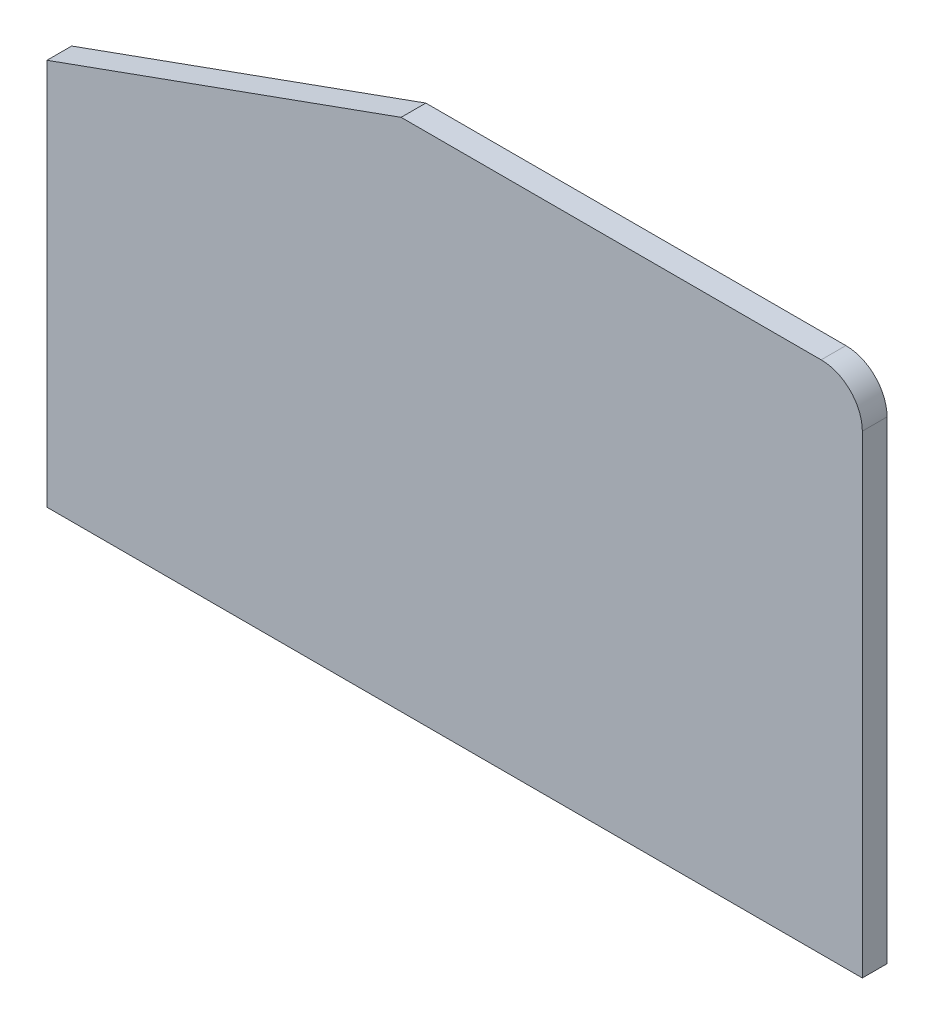
ISO-10303-21;
HEADER;
FILE_DESCRIPTION(('STEP AP214'),'2;1');
FILE_NAME('part.step','',(''),(''),'','','');
FILE_SCHEMA(('AUTOMOTIVE_DESIGN { 1 0 10303 214 1 1 1 1 }'));
ENDSEC;
DATA;
#1=APPLICATION_CONTEXT('core data for automotive mechanical design processes');
#2=APPLICATION_PROTOCOL_DEFINITION('international standard','automotive_design',2000,#1);
#3=PRODUCT_CONTEXT('',#1,'mechanical');
#4=PRODUCT('Part','Part','',(#3));
#5=PRODUCT_RELATED_PRODUCT_CATEGORY('part','',(#4));
#6=PRODUCT_DEFINITION_FORMATION('','',#4);
#7=PRODUCT_DEFINITION_CONTEXT('part definition',#1,'design');
#8=PRODUCT_DEFINITION('design','',#6,#7);
#9=PRODUCT_DEFINITION_SHAPE('','',#8);
#10=(LENGTH_UNIT() NAMED_UNIT(*) SI_UNIT(.MILLI.,.METRE.));
#11=(NAMED_UNIT(*) PLANE_ANGLE_UNIT() SI_UNIT($,.RADIAN.));
#12=(NAMED_UNIT(*) SI_UNIT($,.STERADIAN.) SOLID_ANGLE_UNIT());
#13=UNCERTAINTY_MEASURE_WITH_UNIT(LENGTH_MEASURE(1.E-05),#10,'distance_accuracy_value','');
#14=(GEOMETRIC_REPRESENTATION_CONTEXT(3) GLOBAL_UNCERTAINTY_ASSIGNED_CONTEXT((#13)) GLOBAL_UNIT_ASSIGNED_CONTEXT((#10,
#11,#12)) REPRESENTATION_CONTEXT('',''));
#15=CARTESIAN_POINT('',(0.,0.,0.));
#16=DIRECTION('',(0.,0.,1.));
#17=DIRECTION('',(1.,0.,0.));
#18=AXIS2_PLACEMENT_3D('',#15,#16,#17);
#19=CARTESIAN_POINT('',(99.0000000000002,-62.5,3.00000000000045));
#20=DIRECTION('',(-1.00000000000001,0.,0.));
#21=DIRECTION('',(0.,0.,1.00000000000001));
#22=AXIS2_PLACEMENT_3D('',#19,#20,#21);
#23=PLANE('',#22);
#24=DIRECTION('',(0.,1.,0.));
#25=VECTOR('',#24,1.);
#26=CARTESIAN_POINT('',(99.0000000000004,-62.5,-3.00000000000045));
#27=LINE('',#26,#25);
#28=CARTESIAN_POINT('',(99.0000000000004,-62.5,-3.00000000000045));
#29=VERTEX_POINT('',#28);
#30=CARTESIAN_POINT('',(99.0000000000004,52.5,-3.00000000000045));
#31=VERTEX_POINT('',#30);
#32=EDGE_CURVE('E135',#29,#31,#27,.T.);
#33=ORIENTED_EDGE('',*,*,#32,.T.);
#34=DIRECTION('',(0.,0.,-1.00000000000001));
#35=VECTOR('',#34,1.);
#36=CARTESIAN_POINT('',(99.0000000000002,52.5,3.00000000000045));
#37=LINE('',#36,#35);
#38=CARTESIAN_POINT('',(99.0000000000002,52.5,3.00000000000045));
#39=VERTEX_POINT('',#38);
#40=EDGE_CURVE('E59',#31,#39,#37,.F.);
#41=ORIENTED_EDGE('',*,*,#40,.T.);
#42=DIRECTION('',(0.,1.,0.));
#43=VECTOR('',#42,1.);
#44=CARTESIAN_POINT('',(99.0000000000002,-62.5,3.00000000000045));
#45=LINE('',#44,#43);
#46=CARTESIAN_POINT('',(99.0000000000002,-62.5,3.00000000000045));
#47=VERTEX_POINT('',#46);
#48=EDGE_CURVE('E113',#47,#39,#45,.T.);
#49=ORIENTED_EDGE('',*,*,#48,.F.);
#50=DIRECTION('',(0.,0.,-1.00000000000001));
#51=VECTOR('',#50,1.);
#52=CARTESIAN_POINT('',(99.0000000000002,-62.5,3.00000000000045));
#53=LINE('',#52,#51);
#54=EDGE_CURVE('E134',#47,#29,#53,.T.);
#55=ORIENTED_EDGE('',*,*,#54,.T.);
#56=EDGE_LOOP('',(#33,#41,#49,#55));
#57=FACE_BOUND('',#56,.T.);
#58=ADVANCED_FACE('F51',(#57),#23,.F.);
#59=CARTESIAN_POINT('',(-12.9999999999999,62.5,3.00000000000017));
#60=DIRECTION('',(0.,-1.,0.));
#61=DIRECTION('',(0.,0.,-1.00000000000001));
#62=AXIS2_PLACEMENT_3D('',#59,#60,#61);
#63=PLANE('',#62);
#64=DIRECTION('',(-1.00000000000001,0.,0.));
#65=VECTOR('',#64,1.);
#66=CARTESIAN_POINT('',(-12.9999999999999,62.5,3.00000000000017));
#67=LINE('',#66,#65);
#68=CARTESIAN_POINT('',(89.0000000000002,62.5,3.00000000000028));
#69=VERTEX_POINT('',#68);
#70=CARTESIAN_POINT('',(-12.9999999999999,62.5,3.00000000000017));
#71=VERTEX_POINT('',#70);
#72=EDGE_CURVE('E103',#69,#71,#67,.T.);
#73=ORIENTED_EDGE('',*,*,#72,.F.);
#74=DIRECTION('',(0.,0.,-1.00000000000001));
#75=VECTOR('',#74,1.);
#76=CARTESIAN_POINT('',(89.0000000000002,62.5,3.00000000000028));
#77=LINE('',#76,#75);
#78=CARTESIAN_POINT('',(89.0000000000009,62.5,-2.99999999999967));
#79=VERTEX_POINT('',#78);
#80=EDGE_CURVE('E121',#69,#79,#77,.T.);
#81=ORIENTED_EDGE('',*,*,#80,.T.);
#82=DIRECTION('',(-1.00000000000001,0.,0.));
#83=VECTOR('',#82,1.);
#84=CARTESIAN_POINT('',(-13.0000000000006,62.5,-3.00000000000011));
#85=LINE('',#84,#83);
#86=CARTESIAN_POINT('',(-13.0000000000006,62.5,-3.00000000000011));
#87=VERTEX_POINT('',#86);
#88=EDGE_CURVE('E118',#79,#87,#85,.T.);
#89=ORIENTED_EDGE('',*,*,#88,.T.);
#90=DIRECTION('',(0.,0.,-1.00000000000001));
#91=VECTOR('',#90,1.);
#92=CARTESIAN_POINT('',(-12.9999999999999,62.5,3.00000000000017));
#93=LINE('',#92,#91);
#94=EDGE_CURVE('E116',#71,#87,#93,.T.);
#95=ORIENTED_EDGE('',*,*,#94,.F.);
#96=EDGE_LOOP('',(#73,#81,#89,#95));
#97=FACE_BOUND('',#96,.T.);
#98=ADVANCED_FACE('F117',(#97),#63,.F.);
#99=CARTESIAN_POINT('',(-99.0000000000004,31.5,3.00000000000034));
#100=DIRECTION('',(0.339106795406579,-0.940747884031148,0.));
#101=DIRECTION('',(0.940747884031155,0.339106795406577,0.));
#102=AXIS2_PLACEMENT_3D('',#99,#100,#101);
#103=PLANE('',#102);
#104=DIRECTION('',(-0.940747884031155,-0.339106795406577,0.));
#105=VECTOR('',#104,1.);
#106=CARTESIAN_POINT('',(-99.0000000000009,31.5,-2.99999999999989));
#107=LINE('',#106,#105);
#108=CARTESIAN_POINT('',(-99.0000000000009,31.5,-2.99999999999989));
#109=VERTEX_POINT('',#108);
#110=EDGE_CURVE('E138',#87,#109,#107,.T.);
#111=ORIENTED_EDGE('',*,*,#110,.T.);
#112=DIRECTION('',(0.,0.,-1.00000000000001));
#113=VECTOR('',#112,1.);
#114=CARTESIAN_POINT('',(-99.0000000000004,31.5,3.00000000000034));
#115=LINE('',#114,#113);
#116=CARTESIAN_POINT('',(-99.0000000000004,31.5,3.00000000000034));
#117=VERTEX_POINT('',#116);
#118=EDGE_CURVE('E122',#117,#109,#115,.T.);
#119=ORIENTED_EDGE('',*,*,#118,.F.);
#120=DIRECTION('',(-0.940747884031155,-0.339106795406577,0.));
#121=VECTOR('',#120,1.);
#122=CARTESIAN_POINT('',(-99.0000000000004,31.5,3.00000000000034));
#123=LINE('',#122,#121);
#124=EDGE_CURVE('E107',#71,#117,#123,.T.);
#125=ORIENTED_EDGE('',*,*,#124,.F.);
#126=ORIENTED_EDGE('',*,*,#94,.T.);
#127=EDGE_LOOP('',(#111,#119,#125,#126));
#128=FACE_BOUND('',#127,.T.);
#129=ADVANCED_FACE('F124',(#128),#103,.F.);
#130=CARTESIAN_POINT('',(-99.0000000000004,-62.5,3.00000000000034));
#131=DIRECTION('',(1.00000000000001,0.,0.));
#132=DIRECTION('',(0.,0.,-1.00000000000001));
#133=AXIS2_PLACEMENT_3D('',#130,#131,#132);
#134=PLANE('',#133);
#135=DIRECTION('',(0.,-1.,0.));
#136=VECTOR('',#135,1.);
#137=CARTESIAN_POINT('',(-99.0000000000009,-62.5,-2.99999999999989));
#138=LINE('',#137,#136);
#139=CARTESIAN_POINT('',(-99.0000000000009,-62.5,-2.99999999999989));
#140=VERTEX_POINT('',#139);
#141=EDGE_CURVE('E140',#109,#140,#138,.T.);
#142=ORIENTED_EDGE('',*,*,#141,.T.);
#143=DIRECTION('',(0.,0.,-1.00000000000001));
#144=VECTOR('',#143,1.);
#145=CARTESIAN_POINT('',(-99.0000000000004,-62.5,3.00000000000034));
#146=LINE('',#145,#144);
#147=CARTESIAN_POINT('',(-99.0000000000004,-62.5,3.00000000000034));
#148=VERTEX_POINT('',#147);
#149=EDGE_CURVE('E146',#148,#140,#146,.T.);
#150=ORIENTED_EDGE('',*,*,#149,.F.);
#151=DIRECTION('',(0.,-1.,0.));
#152=VECTOR('',#151,1.);
#153=CARTESIAN_POINT('',(-99.0000000000004,-62.5,3.00000000000034));
#154=LINE('',#153,#152);
#155=EDGE_CURVE('E127',#117,#148,#154,.T.);
#156=ORIENTED_EDGE('',*,*,#155,.F.);
#157=ORIENTED_EDGE('',*,*,#118,.T.);
#158=EDGE_LOOP('',(#142,#150,#156,#157));
#159=FACE_BOUND('',#158,.T.);
#160=ADVANCED_FACE('F156',(#159),#134,.F.);
#161=CARTESIAN_POINT('',(-99.0000000000004,-62.5,3.00000000000034));
#162=DIRECTION('',(0.,1.,0.));
#163=DIRECTION('',(0.,0.,1.00000000000001));
#164=AXIS2_PLACEMENT_3D('',#161,#162,#163);
#165=PLANE('',#164);
#166=DIRECTION('',(1.00000000000001,0.,0.));
#167=VECTOR('',#166,1.);
#168=CARTESIAN_POINT('',(-99.0000000000009,-62.5,-2.99999999999989));
#169=LINE('',#168,#167);
#170=EDGE_CURVE('E142',#140,#29,#169,.T.);
#171=ORIENTED_EDGE('',*,*,#170,.T.);
#172=ORIENTED_EDGE('',*,*,#54,.F.);
#173=DIRECTION('',(1.00000000000001,0.,0.));
#174=VECTOR('',#173,1.);
#175=CARTESIAN_POINT('',(-99.0000000000004,-62.5,3.00000000000034));
#176=LINE('',#175,#174);
#177=EDGE_CURVE('E129',#148,#47,#176,.T.);
#178=ORIENTED_EDGE('',*,*,#177,.F.);
#179=ORIENTED_EDGE('',*,*,#149,.T.);
#180=EDGE_LOOP('',(#171,#172,#178,#179));
#181=FACE_BOUND('',#180,.T.);
#182=ADVANCED_FACE('F161',(#181),#165,.F.);
#183=CARTESIAN_POINT('',(2.22044604925031E-13,0.,3.));
#184=DIRECTION('',(0.,0.,-1.00000000000001));
#185=DIRECTION('',(-1.00000000000001,0.,0.));
#186=AXIS2_PLACEMENT_3D('',#183,#184,#185);
#187=PLANE('',#186);
#188=ORIENTED_EDGE('',*,*,#48,.T.);
#189=CARTESIAN_POINT('',(89.0000000000002,52.5,3.00000000000028));
#190=DIRECTION('',(0.,0.,-1.00000000000001));
#191=DIRECTION('',(-1.00000000000001,0.,0.));
#192=AXIS2_PLACEMENT_3D('',#189,#190,#191);
#193=CIRCLE('',#192,10.);
#194=EDGE_CURVE('E13',#39,#69,#193,.F.);
#195=ORIENTED_EDGE('',*,*,#194,.T.);
#196=ORIENTED_EDGE('',*,*,#72,.T.);
#197=ORIENTED_EDGE('',*,*,#124,.T.);
#198=ORIENTED_EDGE('',*,*,#155,.T.);
#199=ORIENTED_EDGE('',*,*,#177,.T.);
#200=EDGE_LOOP('',(#188,#195,#196,#197,#198,#199));
#201=FACE_BOUND('',#200,.T.);
#202=ADVANCED_FACE('F105',(#201),#187,.F.);
#203=CARTESIAN_POINT('',(-1.11022302462516E-13,0.,-2.99999999999956));
#204=DIRECTION('',(0.,0.,-1.00000000000001));
#205=DIRECTION('',(-1.00000000000001,0.,0.));
#206=AXIS2_PLACEMENT_3D('',#203,#204,#205);
#207=PLANE('',#206);
#208=ORIENTED_EDGE('',*,*,#88,.F.);
#209=CARTESIAN_POINT('',(89.0000000000009,52.5,-2.99999999999967));
#210=DIRECTION('',(0.,0.,-1.00000000000001));
#211=DIRECTION('',(-1.00000000000001,0.,0.));
#212=AXIS2_PLACEMENT_3D('',#209,#210,#211);
#213=CIRCLE('',#212,10.);
#214=EDGE_CURVE('E73',#79,#31,#213,.T.);
#215=ORIENTED_EDGE('',*,*,#214,.T.);
#216=ORIENTED_EDGE('',*,*,#32,.F.);
#217=ORIENTED_EDGE('',*,*,#170,.F.);
#218=ORIENTED_EDGE('',*,*,#141,.F.);
#219=ORIENTED_EDGE('',*,*,#110,.F.);
#220=EDGE_LOOP('',(#208,#215,#216,#217,#218,#219));
#221=FACE_BOUND('',#220,.T.);
#222=ADVANCED_FACE('F152',(#221),#207,.T.);
#223=CARTESIAN_POINT('',(89.0000000000002,52.5,3.00000000000028));
#224=DIRECTION('',(0.,0.,-1.00000000000001));
#225=DIRECTION('',(-1.00000000000001,0.,0.));
#226=AXIS2_PLACEMENT_3D('',#223,#224,#225);
#227=CYLINDRICAL_SURFACE('',#226,10.);
#228=ORIENTED_EDGE('',*,*,#194,.F.);
#229=ORIENTED_EDGE('',*,*,#40,.F.);
#230=ORIENTED_EDGE('',*,*,#214,.F.);
#231=ORIENTED_EDGE('',*,*,#80,.F.);
#232=EDGE_LOOP('',(#228,#229,#230,#231));
#233=FACE_BOUND('',#232,.T.);
#234=ADVANCED_FACE('F53',(#233),#227,.T.);
#235=CLOSED_SHELL('',(#58,#98,#129,#160,#182,#202,#222,#234));
#236=MANIFOLD_SOLID_BREP('B2',#235);
#237=ADVANCED_BREP_SHAPE_REPRESENTATION('',(#18,#236),#14);
#238=SHAPE_DEFINITION_REPRESENTATION(#9,#237);
ENDSEC;
END-ISO-10303-21;
